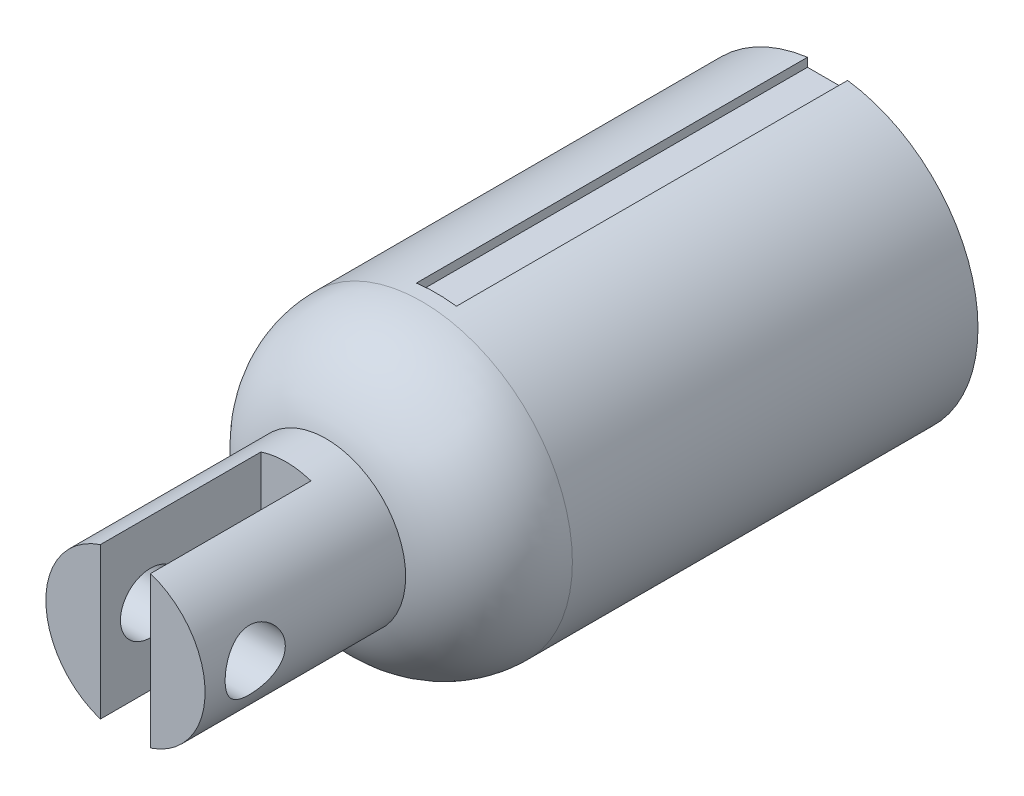
ISO-10303-21;
HEADER;
FILE_DESCRIPTION(('STEP AP214'),'2;1');
FILE_NAME('part.step','',(''),(''),'','','');
FILE_SCHEMA(('AUTOMOTIVE_DESIGN { 1 0 10303 214 1 1 1 1 }'));
ENDSEC;
DATA;
#1=APPLICATION_CONTEXT('core data for automotive mechanical design processes');
#2=APPLICATION_PROTOCOL_DEFINITION('international standard','automotive_design',2000,#1);
#3=PRODUCT_CONTEXT('',#1,'mechanical');
#4=PRODUCT('Part','Part','',(#3));
#5=PRODUCT_RELATED_PRODUCT_CATEGORY('part','',(#4));
#6=PRODUCT_DEFINITION_FORMATION('','',#4);
#7=PRODUCT_DEFINITION_CONTEXT('part definition',#1,'design');
#8=PRODUCT_DEFINITION('design','',#6,#7);
#9=PRODUCT_DEFINITION_SHAPE('','',#8);
#10=(LENGTH_UNIT() NAMED_UNIT(*) SI_UNIT(.MILLI.,.METRE.));
#11=(NAMED_UNIT(*) PLANE_ANGLE_UNIT() SI_UNIT($,.RADIAN.));
#12=(NAMED_UNIT(*) SI_UNIT($,.STERADIAN.) SOLID_ANGLE_UNIT());
#13=UNCERTAINTY_MEASURE_WITH_UNIT(LENGTH_MEASURE(1.E-05),#10,'distance_accuracy_value','');
#14=(GEOMETRIC_REPRESENTATION_CONTEXT(3) GLOBAL_UNCERTAINTY_ASSIGNED_CONTEXT((#13)) GLOBAL_UNIT_ASSIGNED_CONTEXT((#10,
#11,#12)) REPRESENTATION_CONTEXT('',''));
#15=CARTESIAN_POINT('',(0.,0.,0.));
#16=DIRECTION('',(0.,0.,1.));
#17=DIRECTION('',(1.,0.,0.));
#18=AXIS2_PLACEMENT_3D('',#15,#16,#17);
#19=CARTESIAN_POINT('',(0.,0.,0.));
#20=DIRECTION('',(0.,0.,1.));
#21=DIRECTION('',(1.,0.,0.));
#22=AXIS2_PLACEMENT_3D('',#19,#20,#21);
#23=PLANE('',#22);
#24=DIRECTION('',(0.,-1.,0.));
#25=VECTOR('',#24,1.);
#26=CARTESIAN_POINT('',(-2.5,0.,0.));
#27=LINE('',#26,#25);
#28=CARTESIAN_POINT('',(-2.5,7.53351884911693,0.));
#29=VERTEX_POINT('',#28);
#30=CARTESIAN_POINT('',(-2.5,-7.53351884911693,0.));
#31=VERTEX_POINT('',#30);
#32=EDGE_CURVE('E239',#29,#31,#27,.T.);
#33=ORIENTED_EDGE('',*,*,#32,.F.);
#34=CARTESIAN_POINT('',(0.,0.,0.));
#35=DIRECTION('',(0.,0.,1.));
#36=DIRECTION('',(1.,0.,0.));
#37=AXIS2_PLACEMENT_3D('',#34,#35,#36);
#38=CIRCLE('',#37,7.9375);
#39=EDGE_CURVE('E241',#29,#31,#38,.T.);
#40=ORIENTED_EDGE('',*,*,#39,.T.);
#41=EDGE_LOOP('',(#33,#40));
#42=FACE_BOUND('',#41,.T.);
#43=ADVANCED_FACE('F33',(#42),#23,.T.);
#44=CARTESIAN_POINT('',(0.,0.,-20.));
#45=DIRECTION('',(0.,0.,1.));
#46=DIRECTION('',(1.,0.,0.));
#47=AXIS2_PLACEMENT_3D('',#44,#45,#46);
#48=CYLINDRICAL_SURFACE('',#47,7.9375);
#49=CARTESIAN_POINT('',(7.9375,0.,-8.));
#50=CARTESIAN_POINT('',(7.93750470581034,0.162379132527502,-8.00000624556911));
#51=CARTESIAN_POINT('',(7.93247411533966,0.32471584297539,-7.98677545632092));
#52=CARTESIAN_POINT('',(7.91290950547537,0.6445327906901,-7.93442012307883));
#53=CARTESIAN_POINT('',(7.89837701962622,0.802013807340437,-7.89529975748274));
#54=CARTESIAN_POINT('',(7.86136704480697,1.10746046144591,-7.79274982459761));
#55=CARTESIAN_POINT('',(7.83890503631931,1.25544397993121,-7.72936760255163));
#56=CARTESIAN_POINT('',(7.7882692666104,1.53866559635631,-7.58033593763234));
#57=CARTESIAN_POINT('',(7.76009394862707,1.67390020573037,-7.49468042393441));
#58=CARTESIAN_POINT('',(7.69958099968048,1.93360617400591,-7.2996846036578));
#59=CARTESIAN_POINT('',(7.6671242910749,2.05745637262314,-7.18955430955442));
#60=CARTESIAN_POINT('',(7.60228785982822,2.28543178905262,-6.95041216644989));
#61=CARTESIAN_POINT('',(7.56990816441902,2.3895508298604,-6.82139442690714));
#62=CARTESIAN_POINT('',(7.50750049013721,2.57908977685108,-6.54203399912688));
#63=CARTESIAN_POINT('',(7.47761260308017,2.66362686377866,-6.39105789996365));
#64=CARTESIAN_POINT('',(7.42542862557413,2.80583262811522,-6.07572398967982));
#65=CARTESIAN_POINT('',(7.40312944920866,2.8635122305266,-5.91137165172058));
#66=CARTESIAN_POINT('',(7.36992240042169,2.94790462474722,-5.58110510940827));
#67=CARTESIAN_POINT('',(7.35857983008872,2.97580419811252,-5.41553935795268));
#68=CARTESIAN_POINT('',(7.34729958195166,3.00355493972356,-5.08171743948047));
#69=CARTESIAN_POINT('',(7.34735709791989,3.00341792807297,-4.91346243615716));
#70=CARTESIAN_POINT('',(7.35849618464581,2.97600591898068,-4.58995786739647));
#71=CARTESIAN_POINT('',(7.36890565840366,2.95038541000133,-4.43454064913491));
#72=CARTESIAN_POINT('',(7.39845754015187,2.87547153612123,-4.13040156605366));
#73=CARTESIAN_POINT('',(7.41760128459881,2.82617454835165,-3.98168072969478));
#74=CARTESIAN_POINT('',(7.46286409993289,2.70441090562427,-3.69181249380196));
#75=CARTESIAN_POINT('',(7.48910944761733,2.63151958533497,-3.55086406946297));
#76=CARTESIAN_POINT('',(7.54557710189969,2.46493264611752,-3.28272239701989));
#77=CARTESIAN_POINT('',(7.57580079526742,2.37122976484104,-3.15553397366667));
#78=CARTESIAN_POINT('',(7.63933945395458,2.15813916105685,-2.9093762136204));
#79=CARTESIAN_POINT('',(7.67272450486206,2.03743355751381,-2.7915629916633));
#80=CARTESIAN_POINT('',(7.73705042009382,1.77759747202445,-2.57750424652128));
#81=CARTESIAN_POINT('',(7.76799089629511,1.63846407366087,-2.48126214372635));
#82=CARTESIAN_POINT('',(7.82457404472628,1.34273504088227,-2.31177534827365));
#83=CARTESIAN_POINT('',(7.85012447184129,1.18589654127583,-2.23892142511464));
#84=CARTESIAN_POINT('',(7.89236293916295,0.860982833363104,-2.12101786110622));
#85=CARTESIAN_POINT('',(7.90905497996822,0.692912736117342,-2.07595566754349));
#86=CARTESIAN_POINT('',(7.93098971142938,0.360032267126989,-2.01715059485515));
#87=CARTESIAN_POINT('',(7.93680076067606,0.195534063381008,-2.00185125333705));
#88=CARTESIAN_POINT('',(7.9380790613318,-0.13376314535764,-1.99846672507302));
#89=CARTESIAN_POINT('',(7.93354864933619,-0.298562073996559,-2.01037539083057));
#90=CARTESIAN_POINT('',(7.91502775531423,-0.617018899519222,-2.05989009750272));
#91=CARTESIAN_POINT('',(7.90141467517685,-0.770860359462232,-2.09647157226234));
#92=CARTESIAN_POINT('',(7.8664784484321,-1.07010988739698,-2.19293926785258));
#93=CARTESIAN_POINT('',(7.84515429967834,-1.2155168563733,-2.25282851788691));
#94=CARTESIAN_POINT('',(7.79611419165563,-1.49858767890596,-2.39612875436513));
#95=CARTESIAN_POINT('',(7.76822795869529,-1.6358957027633,-2.48018257494498));
#96=CARTESIAN_POINT('',(7.7091412018992,-1.89492132575344,-2.66870094268862));
#97=CARTESIAN_POINT('',(7.67793944298777,-2.0166330775702,-2.77317310819464));
#98=CARTESIAN_POINT('',(7.61337032471035,-2.24851865934969,-3.00680690883752));
#99=CARTESIAN_POINT('',(7.57998373148691,-2.35758938547568,-3.13706092837648));
#100=CARTESIAN_POINT('',(7.51657767922765,-2.55254896089685,-3.41467263481189));
#101=CARTESIAN_POINT('',(7.48655854879118,-2.63843554901586,-3.56203198800871));
#102=CARTESIAN_POINT('',(7.43339364301693,-2.78472331310646,-3.87099538963218));
#103=CARTESIAN_POINT('',(7.41028101876794,-2.84500213727082,-4.03266346205792));
#104=CARTESIAN_POINT('',(7.3742780424416,-2.93707692688182,-4.36497523437658));
#105=CARTESIAN_POINT('',(7.36138122979311,-2.96889089541104,-4.5356131886988));
#106=CARTESIAN_POINT('',(7.34813718249828,-3.00151074197775,-4.8690467779776));
#107=CARTESIAN_POINT('',(7.34702718640067,-3.00420150807635,-5.0316291994311));
#108=CARTESIAN_POINT('',(7.35552201909474,-2.98334154900451,-5.35480079550701));
#109=CARTESIAN_POINT('',(7.36512579812899,-2.95979339477699,-5.51539016385405));
#110=CARTESIAN_POINT('',(7.39332669788241,-2.88860028722911,-5.82487689054722));
#111=CARTESIAN_POINT('',(7.41163102602423,-2.84173767668486,-5.97398319797044));
#112=CARTESIAN_POINT('',(7.4549957647615,-2.72593983409625,-6.26230102896514));
#113=CARTESIAN_POINT('',(7.48005789565156,-2.65699898088199,-6.40151002161625));
#114=CARTESIAN_POINT('',(7.53576700022681,-2.49476236273083,-6.67410735951227));
#115=CARTESIAN_POINT('',(7.56663960990929,-2.40036921611803,-6.80679589929678));
#116=CARTESIAN_POINT('',(7.62972471483441,-2.19159510240641,-7.05505128927686));
#117=CARTESIAN_POINT('',(7.66193763680863,-2.07720773181993,-7.17061263222138));
#118=CARTESIAN_POINT('',(7.72621447183782,-1.82413117462421,-7.38785568382137));
#119=CARTESIAN_POINT('',(7.7581715628303,-1.68444767900419,-7.48841593564079));
#120=CARTESIAN_POINT('',(7.81646488342418,-1.38903968282176,-7.66460991684852));
#121=CARTESIAN_POINT('',(7.84280052325441,-1.23331350168918,-7.74024103126383));
#122=CARTESIAN_POINT('',(7.88794758190596,-0.901926447519422,-7.86697059655263));
#123=CARTESIAN_POINT('',(7.90631708278758,-0.72565821214344,-7.91665375421211));
#124=CARTESIAN_POINT('',(7.93108751232256,-0.366239574946855,-7.98315634994763));
#125=CARTESIAN_POINT('',(7.93749469389896,-0.183092819758328,-7.99999295772283));
#126=CARTESIAN_POINT('',(7.9375,0.,-8.));
#127=B_SPLINE_CURVE_WITH_KNOTS('',3,(#49,#50,#51,#52,#53,#54,#55,#56,#57,#58,#59,#60,#61,#62,
#63,#64,#65,#66,#67,#68,#69,#70,#71,#72,#73,#74,#75,#76,#77,#78,#79,#80,#81,#82,#83,#84,#85,#86,
#87,#88,#89,#90,#91,#92,#93,#94,#95,#96,#97,#98,#99,#100,#101,#102,#103,#104,#105,#106,#107,
#108,#109,#110,#111,#112,#113,#114,#115,#116,#117,#118,#119,#120,#121,#122,#123,#124,#125,#126),
.UNSPECIFIED.,.T.,.F.,(4,2,2,2,2,2,2,2,2,2,2,2,2,2,2,2,2,2,2,2,2,2,2,2,2,2,2,2,2,2,2,2,2,2,2,2,
2,2,4),(0.,0.48646196183436,0.972845431227583,1.45828455794937,1.94385613525288,
2.44826694351071,2.95283540188013,3.47699143850741,4.00093407393715,4.50311312258216,
5.00508045513626,5.47645437159447,5.94790043857093,6.42835353339731,6.90897455004482,
7.42244885006952,7.93600451081603,8.45774107161717,8.97924180632505,9.47264810683821,
9.96594293599256,10.4399204334018,10.9139595520558,11.4020080038601,11.8902389015399,
12.4072506811687,12.9243128673588,13.4438184823172,13.9629952943677,14.4483526447554,
14.9336624430215,15.403686349603,15.8738300205866,16.3688975451409,16.8641239149114,
17.386745888243,17.909422665226,18.4582264778433,19.0067433402691),.UNSPECIFIED.);
#128=CARTESIAN_POINT('',(7.9375,0.,-8.));
#129=VERTEX_POINT('',#128);
#130=EDGE_CURVE('E186',#129,#129,#127,.T.);
#131=ORIENTED_EDGE('',*,*,#130,.F.);
#132=EDGE_LOOP('',(#131));
#133=FACE_BOUND('',#132,.T.);
#134=CARTESIAN_POINT('',(-7.9375,0.,-8.));
#135=CARTESIAN_POINT('',(-7.93750470581034,-0.162379132527502,-8.00000624556911));
#136=CARTESIAN_POINT('',(-7.93247411533966,-0.32471584297539,-7.98677545632092));
#137=CARTESIAN_POINT('',(-7.91290950547537,-0.644532790690101,-7.93442012307883));
#138=CARTESIAN_POINT('',(-7.89837701962622,-0.802013807340437,-7.89529975748274));
#139=CARTESIAN_POINT('',(-7.86136704480697,-1.10746046144591,-7.79274982459761));
#140=CARTESIAN_POINT('',(-7.83890503631931,-1.25544397993121,-7.72936760255163));
#141=CARTESIAN_POINT('',(-7.7882692666104,-1.53866559635631,-7.58033593763234));
#142=CARTESIAN_POINT('',(-7.76009394862707,-1.67390020573037,-7.49468042393441));
#143=CARTESIAN_POINT('',(-7.69958099968048,-1.93360617400591,-7.2996846036578));
#144=CARTESIAN_POINT('',(-7.6671242910749,-2.05745637262314,-7.18955430955442));
#145=CARTESIAN_POINT('',(-7.60228785982822,-2.28543178905262,-6.95041216644989));
#146=CARTESIAN_POINT('',(-7.56990816441902,-2.3895508298604,-6.82139442690714));
#147=CARTESIAN_POINT('',(-7.50750049013721,-2.57908977685108,-6.54203399912688));
#148=CARTESIAN_POINT('',(-7.47761260308017,-2.66362686377866,-6.39105789996365));
#149=CARTESIAN_POINT('',(-7.42542862557413,-2.80583262811522,-6.07572398967982));
#150=CARTESIAN_POINT('',(-7.40312944920866,-2.8635122305266,-5.91137165172058));
#151=CARTESIAN_POINT('',(-7.36992240042169,-2.94790462474722,-5.58110510940827));
#152=CARTESIAN_POINT('',(-7.35857983008872,-2.97580419811252,-5.41553935795268));
#153=CARTESIAN_POINT('',(-7.34729958195166,-3.00355493972356,-5.08171743948047));
#154=CARTESIAN_POINT('',(-7.34735709791989,-3.00341792807297,-4.91346243615716));
#155=CARTESIAN_POINT('',(-7.35849618464581,-2.97600591898068,-4.58995786739647));
#156=CARTESIAN_POINT('',(-7.36890565840366,-2.95038541000133,-4.43454064913491));
#157=CARTESIAN_POINT('',(-7.39845754015187,-2.87547153612123,-4.13040156605366));
#158=CARTESIAN_POINT('',(-7.41760128459881,-2.82617454835165,-3.98168072969478));
#159=CARTESIAN_POINT('',(-7.46286409993289,-2.70441090562427,-3.69181249380196));
#160=CARTESIAN_POINT('',(-7.48910944761733,-2.63151958533497,-3.55086406946297));
#161=CARTESIAN_POINT('',(-7.54557710189969,-2.46493264611752,-3.28272239701989));
#162=CARTESIAN_POINT('',(-7.57580079526742,-2.37122976484104,-3.15553397366667));
#163=CARTESIAN_POINT('',(-7.63933945395458,-2.15813916105685,-2.9093762136204));
#164=CARTESIAN_POINT('',(-7.67272450486206,-2.03743355751381,-2.7915629916633));
#165=CARTESIAN_POINT('',(-7.73705042009382,-1.77759747202445,-2.57750424652128));
#166=CARTESIAN_POINT('',(-7.76799089629511,-1.63846407366087,-2.48126214372635));
#167=CARTESIAN_POINT('',(-7.82457404472628,-1.34273504088227,-2.31177534827365));
#168=CARTESIAN_POINT('',(-7.85012447184129,-1.18589654127583,-2.23892142511464));
#169=CARTESIAN_POINT('',(-7.89236293916295,-0.860982833363104,-2.12101786110622));
#170=CARTESIAN_POINT('',(-7.90905497996822,-0.692912736117342,-2.07595566754349));
#171=CARTESIAN_POINT('',(-7.93098971142938,-0.360032267126989,-2.01715059485515));
#172=CARTESIAN_POINT('',(-7.93680076067606,-0.195534063381008,-2.00185125333705));
#173=CARTESIAN_POINT('',(-7.9380790613318,0.13376314535764,-1.99846672507302));
#174=CARTESIAN_POINT('',(-7.93354864933619,0.298562073996559,-2.01037539083057));
#175=CARTESIAN_POINT('',(-7.91502775531423,0.617018899519222,-2.05989009750272));
#176=CARTESIAN_POINT('',(-7.90141467517685,0.770860359462232,-2.09647157226234));
#177=CARTESIAN_POINT('',(-7.8664784484321,1.07010988739698,-2.19293926785258));
#178=CARTESIAN_POINT('',(-7.84515429967834,1.2155168563733,-2.25282851788691));
#179=CARTESIAN_POINT('',(-7.79611419165563,1.49858767890596,-2.39612875436513));
#180=CARTESIAN_POINT('',(-7.76822795869529,1.6358957027633,-2.48018257494498));
#181=CARTESIAN_POINT('',(-7.7091412018992,1.89492132575344,-2.66870094268862));
#182=CARTESIAN_POINT('',(-7.67793944298777,2.0166330775702,-2.77317310819464));
#183=CARTESIAN_POINT('',(-7.61337032471035,2.24851865934969,-3.00680690883752));
#184=CARTESIAN_POINT('',(-7.57998373148691,2.35758938547568,-3.13706092837648));
#185=CARTESIAN_POINT('',(-7.51657767922765,2.55254896089685,-3.41467263481189));
#186=CARTESIAN_POINT('',(-7.48655854879118,2.63843554901586,-3.56203198800871));
#187=CARTESIAN_POINT('',(-7.43339364301693,2.78472331310646,-3.87099538963218));
#188=CARTESIAN_POINT('',(-7.41028101876794,2.84500213727082,-4.03266346205792));
#189=CARTESIAN_POINT('',(-7.3742780424416,2.93707692688182,-4.36497523437658));
#190=CARTESIAN_POINT('',(-7.36138122979311,2.96889089541104,-4.5356131886988));
#191=CARTESIAN_POINT('',(-7.34813718249828,3.00151074197775,-4.8690467779776));
#192=CARTESIAN_POINT('',(-7.34702718640067,3.00420150807635,-5.0316291994311));
#193=CARTESIAN_POINT('',(-7.35552201909474,2.98334154900451,-5.35480079550701));
#194=CARTESIAN_POINT('',(-7.36512579812899,2.95979339477699,-5.51539016385405));
#195=CARTESIAN_POINT('',(-7.39332669788241,2.88860028722911,-5.82487689054722));
#196=CARTESIAN_POINT('',(-7.41163102602423,2.84173767668486,-5.97398319797044));
#197=CARTESIAN_POINT('',(-7.4549957647615,2.72593983409625,-6.26230102896514));
#198=CARTESIAN_POINT('',(-7.48005789565156,2.65699898088199,-6.40151002161625));
#199=CARTESIAN_POINT('',(-7.53576700022681,2.49476236273083,-6.67410735951227));
#200=CARTESIAN_POINT('',(-7.56663960990929,2.40036921611803,-6.80679589929678));
#201=CARTESIAN_POINT('',(-7.62972471483441,2.19159510240641,-7.05505128927686));
#202=CARTESIAN_POINT('',(-7.66193763680863,2.07720773181993,-7.17061263222138));
#203=CARTESIAN_POINT('',(-7.72621447183782,1.82413117462421,-7.38785568382137));
#204=CARTESIAN_POINT('',(-7.75817156283029,1.68444767900419,-7.48841593564079));
#205=CARTESIAN_POINT('',(-7.81646488342418,1.38903968282176,-7.66460991684852));
#206=CARTESIAN_POINT('',(-7.84280052325441,1.23331350168918,-7.74024103126383));
#207=CARTESIAN_POINT('',(-7.88794758190596,0.901926447519422,-7.86697059655263));
#208=CARTESIAN_POINT('',(-7.90631708278758,0.72565821214344,-7.91665375421211));
#209=CARTESIAN_POINT('',(-7.93108751232256,0.366239574946856,-7.98315634994763));
#210=CARTESIAN_POINT('',(-7.93749469389896,0.183092819758328,-7.99999295772282));
#211=CARTESIAN_POINT('',(-7.9375,0.,-8.));
#212=B_SPLINE_CURVE_WITH_KNOTS('',3,(#134,#135,#136,#137,#138,#139,#140,#141,#142,#143,#144,
#145,#146,#147,#148,#149,#150,#151,#152,#153,#154,#155,#156,#157,#158,#159,#160,#161,#162,#163,
#164,#165,#166,#167,#168,#169,#170,#171,#172,#173,#174,#175,#176,#177,#178,#179,#180,#181,#182,
#183,#184,#185,#186,#187,#188,#189,#190,#191,#192,#193,#194,#195,#196,#197,#198,#199,#200,#201,
#202,#203,#204,#205,#206,#207,#208,#209,#210,#211),.UNSPECIFIED.,.T.,.F.,(4,2,2,2,2,2,2,2,2,2,2,
2,2,2,2,2,2,2,2,2,2,2,2,2,2,2,2,2,2,2,2,2,2,2,2,2,2,2,4),(0.,0.486461961834361,
0.972845431227582,1.45828455794937,1.94385613525288,2.44826694351071,2.95283540188013,
3.47699143850741,4.00093407393715,4.50311312258216,5.00508045513626,5.47645437159447,
5.94790043857093,6.42835353339731,6.90897455004482,7.42244885006952,7.93600451081603,
8.45774107161717,8.97924180632505,9.47264810683821,9.96594293599256,10.4399204334018,
10.9139595520558,11.4020080038601,11.8902389015399,12.4072506811687,12.9243128673588,
13.4438184823172,13.9629952943677,14.4483526447554,14.9336624430215,15.403686349603,
15.8738300205866,16.3688975451409,16.8641239149114,17.386745888243,17.909422665226,
18.4582264778433,19.0067433402691),.UNSPECIFIED.);
#213=CARTESIAN_POINT('',(-7.9375,0.,-8.));
#214=VERTEX_POINT('',#213);
#215=EDGE_CURVE('E180',#214,#214,#212,.T.);
#216=ORIENTED_EDGE('',*,*,#215,.F.);
#217=EDGE_LOOP('',(#216));
#218=FACE_BOUND('',#217,.T.);
#219=DIRECTION('',(0.,0.,1.));
#220=VECTOR('',#219,1.);
#221=CARTESIAN_POINT('',(-2.5,-7.53351884911693,-20.));
#222=LINE('',#221,#220);
#223=CARTESIAN_POINT('',(-2.5,-7.53351884911693,-16.));
#224=VERTEX_POINT('',#223);
#225=EDGE_CURVE('E253',#31,#224,#222,.F.);
#226=ORIENTED_EDGE('',*,*,#225,.F.);
#227=ORIENTED_EDGE('',*,*,#39,.F.);
#228=DIRECTION('',(0.,0.,1.));
#229=VECTOR('',#228,1.);
#230=CARTESIAN_POINT('',(-2.5,7.53351884911693,-20.));
#231=LINE('',#230,#229);
#232=CARTESIAN_POINT('',(-2.5,7.53351884911693,-16.));
#233=VERTEX_POINT('',#232);
#234=EDGE_CURVE('E251',#233,#29,#231,.T.);
#235=ORIENTED_EDGE('',*,*,#234,.F.);
#236=CARTESIAN_POINT('',(0.,0.,-16.));
#237=DIRECTION('',(0.,0.,1.));
#238=DIRECTION('',(1.,0.,0.));
#239=AXIS2_PLACEMENT_3D('',#236,#237,#238);
#240=CIRCLE('',#239,7.9375);
#241=CARTESIAN_POINT('',(2.5,7.53351884911693,-16.));
#242=VERTEX_POINT('',#241);
#243=EDGE_CURVE('E244',#233,#242,#240,.F.);
#244=ORIENTED_EDGE('',*,*,#243,.T.);
#245=DIRECTION('',(0.,0.,1.));
#246=VECTOR('',#245,1.);
#247=CARTESIAN_POINT('',(2.5,7.53351884911693,-20.));
#248=LINE('',#247,#246);
#249=CARTESIAN_POINT('',(2.5,7.53351884911693,0.));
#250=VERTEX_POINT('',#249);
#251=EDGE_CURVE('E293',#250,#242,#248,.F.);
#252=ORIENTED_EDGE('',*,*,#251,.F.);
#253=CARTESIAN_POINT('',(2.5,-7.53351884911693,0.));
#254=VERTEX_POINT('',#253);
#255=EDGE_CURVE('E255',#254,#250,#38,.T.);
#256=ORIENTED_EDGE('',*,*,#255,.F.);
#257=DIRECTION('',(0.,0.,1.));
#258=VECTOR('',#257,1.);
#259=CARTESIAN_POINT('',(2.5,-7.53351884911693,-20.));
#260=LINE('',#259,#258);
#261=CARTESIAN_POINT('',(2.5,-7.53351884911693,-16.));
#262=VERTEX_POINT('',#261);
#263=EDGE_CURVE('E295',#262,#254,#260,.T.);
#264=ORIENTED_EDGE('',*,*,#263,.F.);
#265=EDGE_CURVE('E266',#262,#224,#240,.F.);
#266=ORIENTED_EDGE('',*,*,#265,.T.);
#267=EDGE_LOOP('',(#226,#227,#235,#244,#252,#256,#264,#266));
#268=FACE_BOUND('',#267,.T.);
#269=CARTESIAN_POINT('',(0.,0.,-20.));
#270=DIRECTION('',(0.,0.,-1.));
#271=DIRECTION('',(-1.,0.,0.));
#272=AXIS2_PLACEMENT_3D('',#269,#270,#271);
#273=CIRCLE('',#272,7.9375);
#274=CARTESIAN_POINT('',(-7.9375,0.,-20.));
#275=VERTEX_POINT('',#274);
#276=EDGE_CURVE('E260',#275,#275,#273,.F.);
#277=ORIENTED_EDGE('',*,*,#276,.T.);
#278=EDGE_LOOP('',(#277));
#279=FACE_BOUND('',#278,.T.);
#280=ADVANCED_FACE('F190',(#133,#218,#268,#279),#48,.T.);
#281=DIRECTION('',(0.,1.,0.));
#282=VECTOR('',#281,1.);
#283=CARTESIAN_POINT('',(2.5,0.,0.));
#284=LINE('',#283,#282);
#285=EDGE_CURVE('E245',#254,#250,#284,.T.);
#286=ORIENTED_EDGE('',*,*,#285,.F.);
#287=ORIENTED_EDGE('',*,*,#255,.T.);
#288=EDGE_LOOP('',(#286,#287));
#289=FACE_BOUND('',#288,.T.);
#290=ADVANCED_FACE('F222',(#289),#23,.T.);
#291=CARTESIAN_POINT('',(0.,0.,-70.));
#292=DIRECTION('',(0.,0.,1.));
#293=DIRECTION('',(1.,0.,0.));
#294=AXIS2_PLACEMENT_3D('',#291,#292,#293);
#295=CYLINDRICAL_SURFACE('',#294,15.);
#296=CARTESIAN_POINT('',(0.,0.,-29.5588228223982));
#297=DIRECTION('',(0.,0.,1.));
#298=DIRECTION('',(1.,0.,0.));
#299=AXIS2_PLACEMENT_3D('',#296,#297,#298);
#300=CIRCLE('',#299,15.);
#301=CARTESIAN_POINT('',(15.,0.,-29.5588228223982));
#302=VERTEX_POINT('',#301);
#303=EDGE_CURVE('E254',#302,#302,#300,.F.);
#304=ORIENTED_EDGE('',*,*,#303,.T.);
#305=EDGE_LOOP('',(#304));
#306=FACE_BOUND('',#305,.T.);
#307=CARTESIAN_POINT('',(0.,0.,-31.));
#308=DIRECTION('',(0.,0.,-1.));
#309=DIRECTION('',(-1.,0.,0.));
#310=AXIS2_PLACEMENT_3D('',#307,#308,#309);
#311=CIRCLE('',#310,15.);
#312=CARTESIAN_POINT('',(2.,-14.8660687473185,-31.));
#313=VERTEX_POINT('',#312);
#314=CARTESIAN_POINT('',(-2.,-14.8660687473185,-31.));
#315=VERTEX_POINT('',#314);
#316=EDGE_CURVE('E11',#313,#315,#311,.T.);
#317=ORIENTED_EDGE('',*,*,#316,.F.);
#318=DIRECTION('',(0.,0.,1.));
#319=VECTOR('',#318,1.);
#320=CARTESIAN_POINT('',(2.,-14.8660687473185,-70.));
#321=LINE('',#320,#319);
#322=CARTESIAN_POINT('',(2.,-14.8660687473185,-70.));
#323=VERTEX_POINT('',#322);
#324=EDGE_CURVE('E150',#313,#323,#321,.F.);
#325=ORIENTED_EDGE('',*,*,#324,.T.);
#326=CARTESIAN_POINT('',(0.,0.,-70.));
#327=DIRECTION('',(0.,0.,-1.));
#328=DIRECTION('',(-1.,0.,0.));
#329=AXIS2_PLACEMENT_3D('',#326,#327,#328);
#330=CIRCLE('',#329,15.);
#331=CARTESIAN_POINT('',(2.,14.8660687473185,-70.));
#332=VERTEX_POINT('',#331);
#333=EDGE_CURVE('E288',#332,#323,#330,.T.);
#334=ORIENTED_EDGE('',*,*,#333,.F.);
#335=DIRECTION('',(0.,0.,1.));
#336=VECTOR('',#335,1.);
#337=CARTESIAN_POINT('',(2.,14.8660687473185,-70.));
#338=LINE('',#337,#336);
#339=CARTESIAN_POINT('',(2.,14.8660687473185,-31.));
#340=VERTEX_POINT('',#339);
#341=EDGE_CURVE('E56',#332,#340,#338,.T.);
#342=ORIENTED_EDGE('',*,*,#341,.T.);
#343=CARTESIAN_POINT('',(0.,0.,-31.));
#344=DIRECTION('',(0.,0.,1.));
#345=DIRECTION('',(1.,0.,0.));
#346=AXIS2_PLACEMENT_3D('',#343,#344,#345);
#347=CIRCLE('',#346,15.);
#348=CARTESIAN_POINT('',(-2.,14.8660687473185,-31.));
#349=VERTEX_POINT('',#348);
#350=EDGE_CURVE('E271',#340,#349,#347,.T.);
#351=ORIENTED_EDGE('',*,*,#350,.T.);
#352=DIRECTION('',(0.,0.,1.));
#353=VECTOR('',#352,1.);
#354=CARTESIAN_POINT('',(-2.,14.8660687473185,-70.));
#355=LINE('',#354,#353);
#356=CARTESIAN_POINT('',(-2.,14.8660687473185,-70.));
#357=VERTEX_POINT('',#356);
#358=EDGE_CURVE('E173',#349,#357,#355,.F.);
#359=ORIENTED_EDGE('',*,*,#358,.T.);
#360=CARTESIAN_POINT('',(-2.,-14.8660687473185,-70.));
#361=VERTEX_POINT('',#360);
#362=EDGE_CURVE('E287',#361,#357,#330,.T.);
#363=ORIENTED_EDGE('',*,*,#362,.F.);
#364=DIRECTION('',(0.,0.,1.));
#365=VECTOR('',#364,1.);
#366=CARTESIAN_POINT('',(-2.,-14.8660687473185,-70.));
#367=LINE('',#366,#365);
#368=EDGE_CURVE('E48',#361,#315,#367,.T.);
#369=ORIENTED_EDGE('',*,*,#368,.T.);
#370=EDGE_LOOP('',(#317,#325,#334,#342,#351,#359,#363,#369));
#371=FACE_BOUND('',#370,.T.);
#372=ADVANCED_FACE('F219',(#306,#371),#295,.T.);
#373=CARTESIAN_POINT('',(0.,0.,-70.));
#374=DIRECTION('',(0.,0.,-1.));
#375=DIRECTION('',(-1.,0.,0.));
#376=AXIS2_PLACEMENT_3D('',#373,#374,#375);
#377=PLANE('',#376);
#378=DIRECTION('',(0.,-1.,0.));
#379=VECTOR('',#378,1.);
#380=CARTESIAN_POINT('',(2.,-14.,-70.));
#381=LINE('',#380,#379);
#382=CARTESIAN_POINT('',(2.,-14.,-70.));
#383=VERTEX_POINT('',#382);
#384=EDGE_CURVE('E144',#383,#323,#381,.T.);
#385=ORIENTED_EDGE('',*,*,#384,.F.);
#386=DIRECTION('',(1.,0.,0.));
#387=VECTOR('',#386,1.);
#388=CARTESIAN_POINT('',(2.,-14.,-70.));
#389=LINE('',#388,#387);
#390=CARTESIAN_POINT('',(-2.,-14.,-70.));
#391=VERTEX_POINT('',#390);
#392=EDGE_CURVE('E146',#391,#383,#389,.T.);
#393=ORIENTED_EDGE('',*,*,#392,.F.);
#394=DIRECTION('',(0.,1.,0.));
#395=VECTOR('',#394,1.);
#396=CARTESIAN_POINT('',(-2.,0.,-70.));
#397=LINE('',#396,#395);
#398=EDGE_CURVE('E41',#361,#391,#397,.T.);
#399=ORIENTED_EDGE('',*,*,#398,.F.);
#400=ORIENTED_EDGE('',*,*,#362,.T.);
#401=DIRECTION('',(0.,1.,0.));
#402=VECTOR('',#401,1.);
#403=CARTESIAN_POINT('',(-2.,14.,-70.));
#404=LINE('',#403,#402);
#405=CARTESIAN_POINT('',(-2.,14.,-70.));
#406=VERTEX_POINT('',#405);
#407=EDGE_CURVE('E153',#406,#357,#404,.T.);
#408=ORIENTED_EDGE('',*,*,#407,.F.);
#409=DIRECTION('',(-1.,0.,0.));
#410=VECTOR('',#409,1.);
#411=CARTESIAN_POINT('',(2.,14.,-70.));
#412=LINE('',#411,#410);
#413=CARTESIAN_POINT('',(2.,14.,-70.));
#414=VERTEX_POINT('',#413);
#415=EDGE_CURVE('E158',#414,#406,#412,.T.);
#416=ORIENTED_EDGE('',*,*,#415,.F.);
#417=DIRECTION('',(0.,-1.,0.));
#418=VECTOR('',#417,1.);
#419=CARTESIAN_POINT('',(2.,0.,-70.));
#420=LINE('',#419,#418);
#421=EDGE_CURVE('E269',#332,#414,#420,.T.);
#422=ORIENTED_EDGE('',*,*,#421,.F.);
#423=ORIENTED_EDGE('',*,*,#333,.T.);
#424=EDGE_LOOP('',(#385,#393,#399,#400,#408,#416,#422,#423));
#425=FACE_BOUND('',#424,.T.);
#426=ADVANCED_FACE('F216',(#425),#377,.T.);
#427=CARTESIAN_POINT('',(0.,0.,-29.5588228223982));
#428=DIRECTION('',(0.,0.,1.));
#429=DIRECTION('',(1.,0.,0.));
#430=AXIS2_PLACEMENT_3D('',#427,#428,#429);
#431=DEGENERATE_TOROIDAL_SURFACE('',#430,5.,10.,.T.);
#432=ORIENTED_EDGE('',*,*,#276,.F.);
#433=EDGE_LOOP('',(#432));
#434=FACE_BOUND('',#433,.T.);
#435=ORIENTED_EDGE('',*,*,#303,.F.);
#436=EDGE_LOOP('',(#435));
#437=FACE_BOUND('',#436,.T.);
#438=ADVANCED_FACE('F35',(#434,#437),#431,.T.);
#439=CARTESIAN_POINT('',(-2.5,-10.5829319723835,-16.));
#440=DIRECTION('',(-1.,0.,0.));
#441=DIRECTION('',(0.,0.,1.));
#442=AXIS2_PLACEMENT_3D('',#439,#440,#441);
#443=PLANE('',#442);
#444=CARTESIAN_POINT('',(-2.5,0.,-5.));
#445=DIRECTION('',(-1.,0.,0.));
#446=DIRECTION('',(0.,0.,1.));
#447=AXIS2_PLACEMENT_3D('',#444,#445,#446);
#448=CIRCLE('',#447,3.);
#449=CARTESIAN_POINT('',(-2.5,0.,-2.));
#450=VERTEX_POINT('',#449);
#451=EDGE_CURVE('E177',#450,#450,#448,.T.);
#452=ORIENTED_EDGE('',*,*,#451,.T.);
#453=EDGE_LOOP('',(#452));
#454=FACE_BOUND('',#453,.T.);
#455=ORIENTED_EDGE('',*,*,#225,.T.);
#456=DIRECTION('',(0.,-1.,0.));
#457=VECTOR('',#456,1.);
#458=CARTESIAN_POINT('',(-2.5,-10.5829319723835,-16.));
#459=LINE('',#458,#457);
#460=EDGE_CURVE('E299',#233,#224,#459,.T.);
#461=ORIENTED_EDGE('',*,*,#460,.F.);
#462=ORIENTED_EDGE('',*,*,#234,.T.);
#463=ORIENTED_EDGE('',*,*,#32,.T.);
#464=EDGE_LOOP('',(#455,#461,#462,#463));
#465=FACE_BOUND('',#464,.T.);
#466=ADVANCED_FACE('F211',(#454,#465),#443,.F.);
#467=CARTESIAN_POINT('',(2.5,-10.5829319723835,-16.));
#468=DIRECTION('',(1.,0.,0.));
#469=DIRECTION('',(0.,0.,-1.));
#470=AXIS2_PLACEMENT_3D('',#467,#468,#469);
#471=PLANE('',#470);
#472=CARTESIAN_POINT('',(2.5,0.,-5.));
#473=DIRECTION('',(1.,0.,0.));
#474=DIRECTION('',(0.,0.,-1.));
#475=AXIS2_PLACEMENT_3D('',#472,#473,#474);
#476=CIRCLE('',#475,3.);
#477=CARTESIAN_POINT('',(2.5,0.,-8.));
#478=VERTEX_POINT('',#477);
#479=EDGE_CURVE('E176',#478,#478,#476,.T.);
#480=ORIENTED_EDGE('',*,*,#479,.T.);
#481=EDGE_LOOP('',(#480));
#482=FACE_BOUND('',#481,.T.);
#483=ORIENTED_EDGE('',*,*,#251,.T.);
#484=DIRECTION('',(0.,1.,0.));
#485=VECTOR('',#484,1.);
#486=CARTESIAN_POINT('',(2.5,-10.5829319723835,-16.));
#487=LINE('',#486,#485);
#488=EDGE_CURVE('E297',#262,#242,#487,.T.);
#489=ORIENTED_EDGE('',*,*,#488,.F.);
#490=ORIENTED_EDGE('',*,*,#263,.T.);
#491=ORIENTED_EDGE('',*,*,#285,.T.);
#492=EDGE_LOOP('',(#483,#489,#490,#491));
#493=FACE_BOUND('',#492,.T.);
#494=ADVANCED_FACE('F207',(#482,#493),#471,.F.);
#495=CARTESIAN_POINT('',(0.,0.,-16.));
#496=DIRECTION('',(0.,0.,1.));
#497=DIRECTION('',(1.,0.,0.));
#498=AXIS2_PLACEMENT_3D('',#495,#496,#497);
#499=PLANE('',#498);
#500=ORIENTED_EDGE('',*,*,#488,.T.);
#501=ORIENTED_EDGE('',*,*,#243,.F.);
#502=ORIENTED_EDGE('',*,*,#460,.T.);
#503=ORIENTED_EDGE('',*,*,#265,.F.);
#504=EDGE_LOOP('',(#500,#501,#502,#503));
#505=FACE_BOUND('',#504,.T.);
#506=ADVANCED_FACE('F203',(#505),#499,.T.);
#507=CARTESIAN_POINT('',(-10.,0.,-5.));
#508=DIRECTION('',(1.,0.,0.));
#509=DIRECTION('',(0.,0.,-1.));
#510=AXIS2_PLACEMENT_3D('',#507,#508,#509);
#511=CYLINDRICAL_SURFACE('',#510,3.);
#512=ORIENTED_EDGE('',*,*,#130,.T.);
#513=EDGE_LOOP('',(#512));
#514=FACE_BOUND('',#513,.T.);
#515=ORIENTED_EDGE('',*,*,#479,.F.);
#516=EDGE_LOOP('',(#515));
#517=FACE_BOUND('',#516,.T.);
#518=ADVANCED_FACE('F199',(#514,#517),#511,.F.);
#519=ORIENTED_EDGE('',*,*,#215,.T.);
#520=EDGE_LOOP('',(#519));
#521=FACE_BOUND('',#520,.T.);
#522=ORIENTED_EDGE('',*,*,#451,.F.);
#523=EDGE_LOOP('',(#522));
#524=FACE_BOUND('',#523,.T.);
#525=ADVANCED_FACE('F193',(#521,#524),#511,.F.);
#526=CARTESIAN_POINT('',(0.,0.,-31.));
#527=DIRECTION('',(0.,0.,1.));
#528=DIRECTION('',(1.,0.,0.));
#529=AXIS2_PLACEMENT_3D('',#526,#527,#528);
#530=PLANE('',#529);
#531=DIRECTION('',(0.,-1.,0.));
#532=VECTOR('',#531,1.);
#533=CARTESIAN_POINT('',(2.,14.,-31.));
#534=LINE('',#533,#532);
#535=CARTESIAN_POINT('',(2.,14.,-31.));
#536=VERTEX_POINT('',#535);
#537=EDGE_CURVE('E157',#340,#536,#534,.T.);
#538=ORIENTED_EDGE('',*,*,#537,.T.);
#539=DIRECTION('',(-1.,0.,0.));
#540=VECTOR('',#539,1.);
#541=CARTESIAN_POINT('',(2.,14.,-31.));
#542=LINE('',#541,#540);
#543=CARTESIAN_POINT('',(-2.,14.,-31.));
#544=VERTEX_POINT('',#543);
#545=EDGE_CURVE('E160',#536,#544,#542,.T.);
#546=ORIENTED_EDGE('',*,*,#545,.T.);
#547=DIRECTION('',(0.,1.,0.));
#548=VECTOR('',#547,1.);
#549=CARTESIAN_POINT('',(-2.,14.,-31.));
#550=LINE('',#549,#548);
#551=EDGE_CURVE('E154',#544,#349,#550,.T.);
#552=ORIENTED_EDGE('',*,*,#551,.T.);
#553=ORIENTED_EDGE('',*,*,#350,.F.);
#554=EDGE_LOOP('',(#538,#546,#552,#553));
#555=FACE_BOUND('',#554,.T.);
#556=ADVANCED_FACE('F198',(#555),#530,.F.);
#557=CARTESIAN_POINT('',(-2.,14.,-31.));
#558=DIRECTION('',(-1.,0.,0.));
#559=DIRECTION('',(0.,0.,1.));
#560=AXIS2_PLACEMENT_3D('',#557,#558,#559);
#561=PLANE('',#560);
#562=ORIENTED_EDGE('',*,*,#551,.F.);
#563=DIRECTION('',(0.,0.,-1.));
#564=VECTOR('',#563,1.);
#565=CARTESIAN_POINT('',(-2.,14.,-31.));
#566=LINE('',#565,#564);
#567=EDGE_CURVE('E168',#544,#406,#566,.T.);
#568=ORIENTED_EDGE('',*,*,#567,.T.);
#569=ORIENTED_EDGE('',*,*,#407,.T.);
#570=ORIENTED_EDGE('',*,*,#358,.F.);
#571=EDGE_LOOP('',(#562,#568,#569,#570));
#572=FACE_BOUND('',#571,.T.);
#573=ADVANCED_FACE('F201',(#572),#561,.F.);
#574=CARTESIAN_POINT('',(2.,14.,-31.));
#575=DIRECTION('',(1.,0.,0.));
#576=DIRECTION('',(0.,0.,-1.));
#577=AXIS2_PLACEMENT_3D('',#574,#575,#576);
#578=PLANE('',#577);
#579=ORIENTED_EDGE('',*,*,#421,.T.);
#580=DIRECTION('',(0.,0.,-1.));
#581=VECTOR('',#580,1.);
#582=CARTESIAN_POINT('',(2.,14.,-31.));
#583=LINE('',#582,#581);
#584=EDGE_CURVE('E163',#536,#414,#583,.T.);
#585=ORIENTED_EDGE('',*,*,#584,.F.);
#586=ORIENTED_EDGE('',*,*,#537,.F.);
#587=ORIENTED_EDGE('',*,*,#341,.F.);
#588=EDGE_LOOP('',(#579,#585,#586,#587));
#589=FACE_BOUND('',#588,.T.);
#590=ADVANCED_FACE('F279',(#589),#578,.F.);
#591=CARTESIAN_POINT('',(2.,14.,-31.));
#592=DIRECTION('',(0.,-1.,0.));
#593=DIRECTION('',(0.,0.,-1.));
#594=AXIS2_PLACEMENT_3D('',#591,#592,#593);
#595=PLANE('',#594);
#596=ORIENTED_EDGE('',*,*,#415,.T.);
#597=ORIENTED_EDGE('',*,*,#567,.F.);
#598=ORIENTED_EDGE('',*,*,#545,.F.);
#599=ORIENTED_EDGE('',*,*,#584,.T.);
#600=EDGE_LOOP('',(#596,#597,#598,#599));
#601=FACE_BOUND('',#600,.T.);
#602=ADVANCED_FACE('F283',(#601),#595,.F.);
#603=CARTESIAN_POINT('',(0.,0.,-31.));
#604=DIRECTION('',(0.,0.,-1.));
#605=DIRECTION('',(-1.,0.,0.));
#606=AXIS2_PLACEMENT_3D('',#603,#604,#605);
#607=PLANE('',#606);
#608=ORIENTED_EDGE('',*,*,#316,.T.);
#609=DIRECTION('',(0.,1.,0.));
#610=VECTOR('',#609,1.);
#611=CARTESIAN_POINT('',(-2.,-14.,-31.));
#612=LINE('',#611,#610);
#613=CARTESIAN_POINT('',(-2.,-14.,-31.));
#614=VERTEX_POINT('',#613);
#615=EDGE_CURVE('E122',#315,#614,#612,.T.);
#616=ORIENTED_EDGE('',*,*,#615,.T.);
#617=DIRECTION('',(1.,0.,0.));
#618=VECTOR('',#617,1.);
#619=CARTESIAN_POINT('',(2.,-14.,-31.));
#620=LINE('',#619,#618);
#621=CARTESIAN_POINT('',(2.,-14.,-31.));
#622=VERTEX_POINT('',#621);
#623=EDGE_CURVE('E127',#614,#622,#620,.T.);
#624=ORIENTED_EDGE('',*,*,#623,.T.);
#625=DIRECTION('',(0.,-1.,0.));
#626=VECTOR('',#625,1.);
#627=CARTESIAN_POINT('',(2.,-14.,-31.));
#628=LINE('',#627,#626);
#629=EDGE_CURVE('E129',#622,#313,#628,.T.);
#630=ORIENTED_EDGE('',*,*,#629,.T.);
#631=EDGE_LOOP('',(#608,#616,#624,#630));
#632=FACE_BOUND('',#631,.T.);
#633=ADVANCED_FACE('F124',(#632),#607,.T.);
#634=CARTESIAN_POINT('',(2.,-14.,-31.));
#635=DIRECTION('',(1.,0.,0.));
#636=DIRECTION('',(0.,0.,-1.));
#637=AXIS2_PLACEMENT_3D('',#634,#635,#636);
#638=PLANE('',#637);
#639=ORIENTED_EDGE('',*,*,#629,.F.);
#640=DIRECTION('',(0.,0.,-1.));
#641=VECTOR('',#640,1.);
#642=CARTESIAN_POINT('',(2.,-14.,-31.));
#643=LINE('',#642,#641);
#644=EDGE_CURVE('E137',#622,#383,#643,.T.);
#645=ORIENTED_EDGE('',*,*,#644,.T.);
#646=ORIENTED_EDGE('',*,*,#384,.T.);
#647=ORIENTED_EDGE('',*,*,#324,.F.);
#648=EDGE_LOOP('',(#639,#645,#646,#647));
#649=FACE_BOUND('',#648,.T.);
#650=ADVANCED_FACE('F353',(#649),#638,.F.);
#651=CARTESIAN_POINT('',(-2.,-14.,-31.));
#652=DIRECTION('',(-1.,0.,0.));
#653=DIRECTION('',(0.,0.,1.));
#654=AXIS2_PLACEMENT_3D('',#651,#652,#653);
#655=PLANE('',#654);
#656=ORIENTED_EDGE('',*,*,#398,.T.);
#657=DIRECTION('',(0.,0.,-1.));
#658=VECTOR('',#657,1.);
#659=CARTESIAN_POINT('',(-2.,-14.,-31.));
#660=LINE('',#659,#658);
#661=EDGE_CURVE('E132',#614,#391,#660,.T.);
#662=ORIENTED_EDGE('',*,*,#661,.F.);
#663=ORIENTED_EDGE('',*,*,#615,.F.);
#664=ORIENTED_EDGE('',*,*,#368,.F.);
#665=EDGE_LOOP('',(#656,#662,#663,#664));
#666=FACE_BOUND('',#665,.T.);
#667=ADVANCED_FACE('F133',(#666),#655,.F.);
#668=CARTESIAN_POINT('',(2.,-14.,-31.));
#669=DIRECTION('',(0.,1.,0.));
#670=DIRECTION('',(0.,0.,1.));
#671=AXIS2_PLACEMENT_3D('',#668,#669,#670);
#672=PLANE('',#671);
#673=ORIENTED_EDGE('',*,*,#392,.T.);
#674=ORIENTED_EDGE('',*,*,#644,.F.);
#675=ORIENTED_EDGE('',*,*,#623,.F.);
#676=ORIENTED_EDGE('',*,*,#661,.T.);
#677=EDGE_LOOP('',(#673,#674,#675,#676));
#678=FACE_BOUND('',#677,.T.);
#679=ADVANCED_FACE('F139',(#678),#672,.F.);
#680=CLOSED_SHELL('',(#43,#280,#290,#372,#426,#438,#466,#494,#506,#518,#525,#556,#573,#590,#602,
#633,#650,#667,#679));
#681=MANIFOLD_SOLID_BREP('B2',#680);
#682=ADVANCED_BREP_SHAPE_REPRESENTATION('',(#18,#681),#14);
#683=SHAPE_DEFINITION_REPRESENTATION(#9,#682);
ENDSEC;
END-ISO-10303-21;
